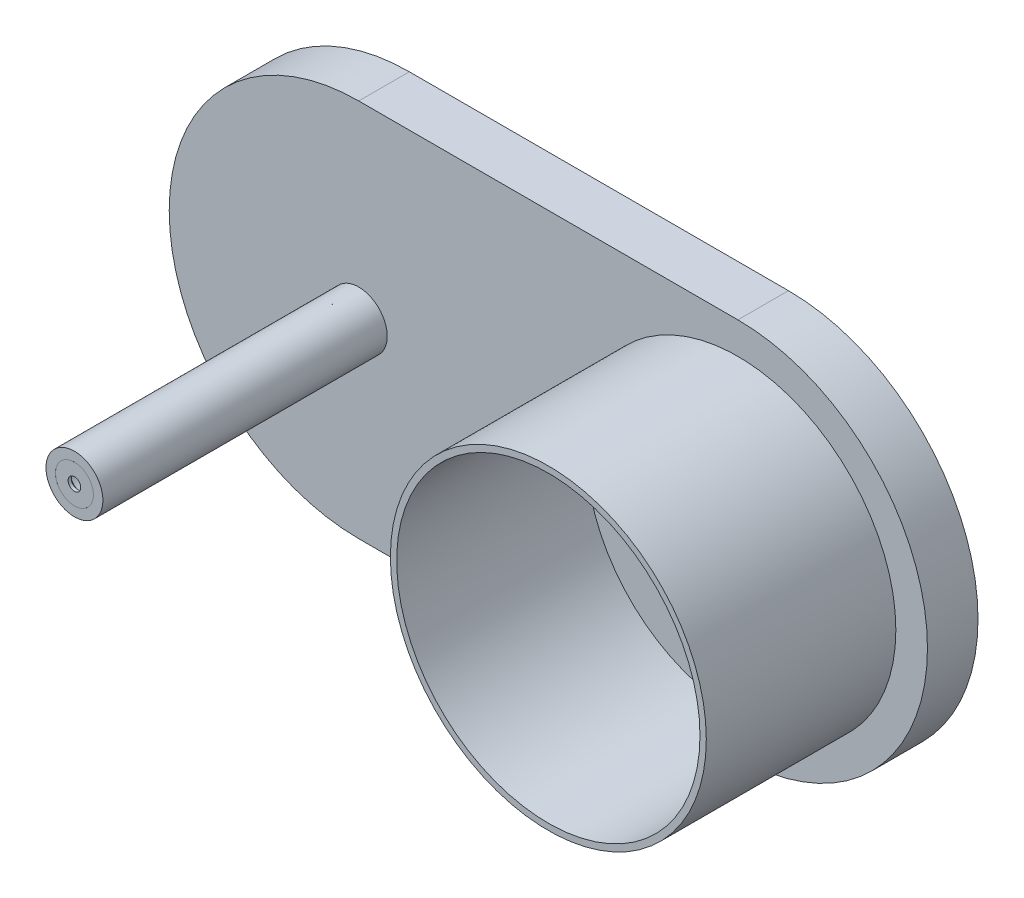
ISO-10303-21;
HEADER;
FILE_DESCRIPTION(('STEP AP214'),'2;1');
FILE_NAME('part.step','',(''),(''),'','','');
FILE_SCHEMA(('AUTOMOTIVE_DESIGN { 1 0 10303 214 1 1 1 1 }'));
ENDSEC;
DATA;
#1=APPLICATION_CONTEXT('core data for automotive mechanical design processes');
#2=APPLICATION_PROTOCOL_DEFINITION('international standard','automotive_design',2000,#1);
#3=PRODUCT_CONTEXT('',#1,'mechanical');
#4=PRODUCT('Part','Part','',(#3));
#5=PRODUCT_RELATED_PRODUCT_CATEGORY('part','',(#4));
#6=PRODUCT_DEFINITION_FORMATION('','',#4);
#7=PRODUCT_DEFINITION_CONTEXT('part definition',#1,'design');
#8=PRODUCT_DEFINITION('design','',#6,#7);
#9=PRODUCT_DEFINITION_SHAPE('','',#8);
#10=(LENGTH_UNIT() NAMED_UNIT(*) SI_UNIT(.MILLI.,.METRE.));
#11=(NAMED_UNIT(*) PLANE_ANGLE_UNIT() SI_UNIT($,.RADIAN.));
#12=(NAMED_UNIT(*) SI_UNIT($,.STERADIAN.) SOLID_ANGLE_UNIT());
#13=UNCERTAINTY_MEASURE_WITH_UNIT(LENGTH_MEASURE(1.E-05),#10,'distance_accuracy_value','');
#14=(GEOMETRIC_REPRESENTATION_CONTEXT(3) GLOBAL_UNCERTAINTY_ASSIGNED_CONTEXT((#13)) GLOBAL_UNIT_ASSIGNED_CONTEXT((#10,
#11,#12)) REPRESENTATION_CONTEXT('',''));
#15=CARTESIAN_POINT('',(0.,0.,0.));
#16=DIRECTION('',(0.,0.,1.));
#17=DIRECTION('',(1.,0.,0.));
#18=AXIS2_PLACEMENT_3D('',#15,#16,#17);
#19=CARTESIAN_POINT('',(-30.,0.,8.));
#20=DIRECTION('',(0.,0.,1.));
#21=DIRECTION('',(1.,0.,0.));
#22=AXIS2_PLACEMENT_3D('',#19,#20,#21);
#23=PLANE('',#22);
#24=CARTESIAN_POINT('',(30.,0.,8.));
#25=DIRECTION('',(0.,0.,1.));
#26=DIRECTION('',(1.,0.,0.));
#27=AXIS2_PLACEMENT_3D('',#24,#25,#26);
#28=CIRCLE('',#27,4.);
#29=CARTESIAN_POINT('',(34.,0.,8.));
#30=VERTEX_POINT('',#29);
#31=EDGE_CURVE('E149',#30,#30,#28,.T.);
#32=ORIENTED_EDGE('',*,*,#31,.F.);
#33=EDGE_LOOP('',(#32));
#34=FACE_BOUND('',#33,.T.);
#35=CARTESIAN_POINT('',(30.,0.,8.));
#36=DIRECTION('',(0.,0.,1.));
#37=DIRECTION('',(1.,0.,0.));
#38=AXIS2_PLACEMENT_3D('',#35,#36,#37);
#39=CIRCLE('',#38,24.);
#40=CARTESIAN_POINT('',(54.,0.,8.));
#41=VERTEX_POINT('',#40);
#42=EDGE_CURVE('E11',#41,#41,#39,.F.);
#43=ORIENTED_EDGE('',*,*,#42,.F.);
#44=EDGE_LOOP('',(#43));
#45=FACE_BOUND('',#44,.T.);
#46=ADVANCED_FACE('F39',(#34,#45),#23,.T.);
#47=CARTESIAN_POINT('',(-30.,0.,2.5));
#48=DIRECTION('',(0.,0.,1.));
#49=DIRECTION('',(1.,0.,0.));
#50=AXIS2_PLACEMENT_3D('',#47,#48,#49);
#51=CYLINDRICAL_SURFACE('',#50,3.);
#52=CARTESIAN_POINT('',(-30.,0.,52.9993084249423));
#53=DIRECTION('',(0.,0.,-1.));
#54=DIRECTION('',(-1.,0.,0.));
#55=AXIS2_PLACEMENT_3D('',#52,#53,#54);
#56=CIRCLE('',#55,2.99999999999998);
#57=CARTESIAN_POINT('',(-33.,0.,52.9993084249423));
#58=VERTEX_POINT('',#57);
#59=EDGE_CURVE('E270',#58,#58,#56,.T.);
#60=ORIENTED_EDGE('',*,*,#59,.T.);
#61=EDGE_LOOP('',(#60));
#62=FACE_BOUND('',#61,.T.);
#63=CARTESIAN_POINT('',(-30.,0.,53.));
#64=DIRECTION('',(0.,0.,1.));
#65=DIRECTION('',(1.,0.,0.));
#66=AXIS2_PLACEMENT_3D('',#63,#64,#65);
#67=CIRCLE('',#66,3.);
#68=CARTESIAN_POINT('',(-27.,0.,53.));
#69=VERTEX_POINT('',#68);
#70=EDGE_CURVE('E251',#69,#69,#67,.T.);
#71=ORIENTED_EDGE('',*,*,#70,.T.);
#72=EDGE_LOOP('',(#71));
#73=FACE_BOUND('',#72,.T.);
#74=ADVANCED_FACE('F307',(#62,#73),#51,.F.);
#75=CARTESIAN_POINT('',(30.,0.,8.));
#76=DIRECTION('',(0.,0.,1.));
#77=DIRECTION('',(1.,0.,0.));
#78=AXIS2_PLACEMENT_3D('',#75,#76,#77);
#79=CIRCLE('',#78,25.);
#80=CARTESIAN_POINT('',(55.,0.,8.));
#81=VERTEX_POINT('',#80);
#82=EDGE_CURVE('E275',#81,#81,#79,.T.);
#83=ORIENTED_EDGE('',*,*,#82,.F.);
#84=EDGE_LOOP('',(#83));
#85=FACE_BOUND('',#84,.T.);
#86=CARTESIAN_POINT('',(-30.,0.,8.));
#87=DIRECTION('',(0.,0.,1.));
#88=DIRECTION('',(1.,0.,0.));
#89=AXIS2_PLACEMENT_3D('',#86,#87,#88);
#90=CIRCLE('',#89,30.);
#91=CARTESIAN_POINT('',(-30.,30.,8.));
#92=VERTEX_POINT('',#91);
#93=CARTESIAN_POINT('',(-30.,-30.,8.));
#94=VERTEX_POINT('',#93);
#95=EDGE_CURVE('E175',#92,#94,#90,.T.);
#96=ORIENTED_EDGE('',*,*,#95,.T.);
#97=DIRECTION('',(1.,0.,0.));
#98=VECTOR('',#97,1.);
#99=CARTESIAN_POINT('',(-30.,-30.,8.));
#100=LINE('',#99,#98);
#101=CARTESIAN_POINT('',(30.,-30.,8.));
#102=VERTEX_POINT('',#101);
#103=EDGE_CURVE('E93',#94,#102,#100,.T.);
#104=ORIENTED_EDGE('',*,*,#103,.T.);
#105=CARTESIAN_POINT('',(30.,0.,8.));
#106=DIRECTION('',(0.,0.,1.));
#107=DIRECTION('',(1.,0.,0.));
#108=AXIS2_PLACEMENT_3D('',#105,#106,#107);
#109=CIRCLE('',#108,30.);
#110=CARTESIAN_POINT('',(30.,30.,8.));
#111=VERTEX_POINT('',#110);
#112=EDGE_CURVE('E180',#102,#111,#109,.T.);
#113=ORIENTED_EDGE('',*,*,#112,.T.);
#114=DIRECTION('',(-1.,0.,0.));
#115=VECTOR('',#114,1.);
#116=CARTESIAN_POINT('',(-30.,30.,8.));
#117=LINE('',#116,#115);
#118=EDGE_CURVE('E64',#111,#92,#117,.T.);
#119=ORIENTED_EDGE('',*,*,#118,.T.);
#120=EDGE_LOOP('',(#96,#104,#113,#119));
#121=FACE_BOUND('',#120,.T.);
#122=CARTESIAN_POINT('',(-30.,0.,8.));
#123=DIRECTION('',(0.,0.,1.));
#124=DIRECTION('',(1.,0.,0.));
#125=AXIS2_PLACEMENT_3D('',#122,#123,#124);
#126=CIRCLE('',#125,4.5);
#127=CARTESIAN_POINT('',(-34.5,0.,7.99999999999999));
#128=VERTEX_POINT('',#127);
#129=EDGE_CURVE('E247',#128,#128,#126,.T.);
#130=ORIENTED_EDGE('',*,*,#129,.F.);
#131=EDGE_LOOP('',(#130));
#132=FACE_BOUND('',#131,.T.);
#133=ADVANCED_FACE('F310',(#85,#121,#132),#23,.T.);
#134=CARTESIAN_POINT('',(-30.,-4.,5.5));
#135=DIRECTION('',(-1.,0.,0.));
#136=DIRECTION('',(0.,0.,1.));
#137=AXIS2_PLACEMENT_3D('',#134,#135,#136);
#138=PLANE('',#137);
#139=DIRECTION('',(0.,1.,0.));
#140=VECTOR('',#139,1.);
#141=CARTESIAN_POINT('',(-30.,-4.,2.5));
#142=LINE('',#141,#140);
#143=CARTESIAN_POINT('',(-30.,-4.,2.5));
#144=VERTEX_POINT('',#143);
#145=CARTESIAN_POINT('',(-30.,-3.,2.5));
#146=VERTEX_POINT('',#145);
#147=EDGE_CURVE('E164',#144,#146,#142,.T.);
#148=ORIENTED_EDGE('',*,*,#147,.T.);
#149=DIRECTION('',(0.,0.,1.));
#150=VECTOR('',#149,1.);
#151=CARTESIAN_POINT('',(-30.,-3.,2.5));
#152=LINE('',#151,#150);
#153=CARTESIAN_POINT('',(-30.,-3.,5.5));
#154=VERTEX_POINT('',#153);
#155=EDGE_CURVE('E226',#146,#154,#152,.T.);
#156=ORIENTED_EDGE('',*,*,#155,.T.);
#157=DIRECTION('',(0.,1.,0.));
#158=VECTOR('',#157,1.);
#159=CARTESIAN_POINT('',(-30.,-4.,5.5));
#160=LINE('',#159,#158);
#161=CARTESIAN_POINT('',(-30.,-4.,5.5));
#162=VERTEX_POINT('',#161);
#163=EDGE_CURVE('E170',#162,#154,#160,.T.);
#164=ORIENTED_EDGE('',*,*,#163,.F.);
#165=DIRECTION('',(0.,0.,1.));
#166=VECTOR('',#165,1.);
#167=CARTESIAN_POINT('',(-30.,-4.,5.5));
#168=LINE('',#167,#166);
#169=EDGE_CURVE('E156',#144,#162,#168,.T.);
#170=ORIENTED_EDGE('',*,*,#169,.F.);
#171=EDGE_LOOP('',(#148,#156,#164,#170));
#172=FACE_BOUND('',#171,.T.);
#173=ADVANCED_FACE('F322',(#172),#138,.F.);
#174=CARTESIAN_POINT('',(-30.,3.,5.5));
#175=VERTEX_POINT('',#174);
#176=CARTESIAN_POINT('',(-30.,4.,5.5));
#177=VERTEX_POINT('',#176);
#178=EDGE_CURVE('E174',#175,#177,#160,.T.);
#179=ORIENTED_EDGE('',*,*,#178,.F.);
#180=DIRECTION('',(0.,0.,1.));
#181=VECTOR('',#180,1.);
#182=CARTESIAN_POINT('',(-30.,3.,2.5));
#183=LINE('',#182,#181);
#184=CARTESIAN_POINT('',(-30.,3.,2.5));
#185=VERTEX_POINT('',#184);
#186=EDGE_CURVE('E55',#175,#185,#183,.F.);
#187=ORIENTED_EDGE('',*,*,#186,.T.);
#188=CARTESIAN_POINT('',(-30.,4.,2.5));
#189=VERTEX_POINT('',#188);
#190=EDGE_CURVE('E169',#185,#189,#142,.T.);
#191=ORIENTED_EDGE('',*,*,#190,.T.);
#192=DIRECTION('',(0.,0.,1.));
#193=VECTOR('',#192,1.);
#194=CARTESIAN_POINT('',(-30.,4.,5.5));
#195=LINE('',#194,#193);
#196=EDGE_CURVE('E154',#189,#177,#195,.T.);
#197=ORIENTED_EDGE('',*,*,#196,.T.);
#198=EDGE_LOOP('',(#179,#187,#191,#197));
#199=FACE_BOUND('',#198,.T.);
#200=ADVANCED_FACE('F215',(#199),#138,.F.);
#201=CARTESIAN_POINT('',(-30.,-4.,2.5));
#202=DIRECTION('',(0.,0.,-1.));
#203=DIRECTION('',(-1.,0.,0.));
#204=AXIS2_PLACEMENT_3D('',#201,#202,#203);
#205=PLANE('',#204);
#206=DIRECTION('',(-1.,0.,0.));
#207=VECTOR('',#206,1.);
#208=CARTESIAN_POINT('',(-30.,-4.,2.5));
#209=LINE('',#208,#207);
#210=CARTESIAN_POINT('',(30.,-4.,2.5));
#211=VERTEX_POINT('',#210);
#212=EDGE_CURVE('E147',#211,#144,#209,.T.);
#213=ORIENTED_EDGE('',*,*,#212,.F.);
#214=CARTESIAN_POINT('',(30.,0.,2.5));
#215=DIRECTION('',(0.,0.,1.));
#216=DIRECTION('',(1.,0.,0.));
#217=AXIS2_PLACEMENT_3D('',#214,#215,#216);
#218=CIRCLE('',#217,4.);
#219=CARTESIAN_POINT('',(30.,4.,2.5));
#220=VERTEX_POINT('',#219);
#221=EDGE_CURVE('E129',#211,#220,#218,.T.);
#222=ORIENTED_EDGE('',*,*,#221,.T.);
#223=DIRECTION('',(-1.,0.,0.));
#224=VECTOR('',#223,1.);
#225=CARTESIAN_POINT('',(-30.,4.,2.5));
#226=LINE('',#225,#224);
#227=EDGE_CURVE('E138',#220,#189,#226,.T.);
#228=ORIENTED_EDGE('',*,*,#227,.T.);
#229=ORIENTED_EDGE('',*,*,#190,.F.);
#230=CARTESIAN_POINT('',(-30.,0.,2.5));
#231=DIRECTION('',(0.,0.,1.));
#232=DIRECTION('',(1.,0.,0.));
#233=AXIS2_PLACEMENT_3D('',#230,#231,#232);
#234=CIRCLE('',#233,3.);
#235=EDGE_CURVE('E239',#185,#146,#234,.T.);
#236=ORIENTED_EDGE('',*,*,#235,.T.);
#237=ORIENTED_EDGE('',*,*,#147,.F.);
#238=EDGE_LOOP('',(#213,#222,#228,#229,#236,#237));
#239=FACE_BOUND('',#238,.T.);
#240=ADVANCED_FACE('F144',(#239),#205,.F.);
#241=CARTESIAN_POINT('',(-30.,-4.,5.5));
#242=DIRECTION('',(0.,0.,1.));
#243=DIRECTION('',(1.,0.,0.));
#244=AXIS2_PLACEMENT_3D('',#241,#242,#243);
#245=PLANE('',#244);
#246=DIRECTION('',(1.,0.,0.));
#247=VECTOR('',#246,1.);
#248=CARTESIAN_POINT('',(-30.,4.,5.5));
#249=LINE('',#248,#247);
#250=CARTESIAN_POINT('',(30.,4.,5.5));
#251=VERTEX_POINT('',#250);
#252=EDGE_CURVE('E139',#177,#251,#249,.T.);
#253=ORIENTED_EDGE('',*,*,#252,.T.);
#254=CARTESIAN_POINT('',(30.,0.,5.5));
#255=DIRECTION('',(0.,0.,1.));
#256=DIRECTION('',(1.,0.,0.));
#257=AXIS2_PLACEMENT_3D('',#254,#255,#256);
#258=CIRCLE('',#257,4.);
#259=CARTESIAN_POINT('',(30.,-4.,5.5));
#260=VERTEX_POINT('',#259);
#261=EDGE_CURVE('E132',#251,#260,#258,.T.);
#262=ORIENTED_EDGE('',*,*,#261,.T.);
#263=DIRECTION('',(1.,0.,0.));
#264=VECTOR('',#263,1.);
#265=CARTESIAN_POINT('',(-30.,-4.,5.5));
#266=LINE('',#265,#264);
#267=EDGE_CURVE('E160',#162,#260,#266,.T.);
#268=ORIENTED_EDGE('',*,*,#267,.F.);
#269=ORIENTED_EDGE('',*,*,#163,.T.);
#270=CARTESIAN_POINT('',(-30.,0.,5.5));
#271=DIRECTION('',(0.,0.,1.));
#272=DIRECTION('',(1.,0.,0.));
#273=AXIS2_PLACEMENT_3D('',#270,#271,#272);
#274=CIRCLE('',#273,3.);
#275=EDGE_CURVE('E48',#154,#175,#274,.T.);
#276=ORIENTED_EDGE('',*,*,#275,.T.);
#277=ORIENTED_EDGE('',*,*,#178,.T.);
#278=EDGE_LOOP('',(#253,#262,#268,#269,#276,#277));
#279=FACE_BOUND('',#278,.T.);
#280=ADVANCED_FACE('F211',(#279),#245,.F.);
#281=CARTESIAN_POINT('',(0.,-4.,0.));
#282=DIRECTION('',(0.,-1.,0.));
#283=DIRECTION('',(0.,0.,-1.));
#284=AXIS2_PLACEMENT_3D('',#281,#282,#283);
#285=PLANE('',#284);
#286=ORIENTED_EDGE('',*,*,#169,.T.);
#287=ORIENTED_EDGE('',*,*,#267,.T.);
#288=DIRECTION('',(0.,0.,-1.));
#289=VECTOR('',#288,1.);
#290=CARTESIAN_POINT('',(30.,-4.,5.5));
#291=LINE('',#290,#289);
#292=EDGE_CURVE('E218',#260,#211,#291,.T.);
#293=ORIENTED_EDGE('',*,*,#292,.T.);
#294=ORIENTED_EDGE('',*,*,#212,.T.);
#295=EDGE_LOOP('',(#286,#287,#293,#294));
#296=FACE_BOUND('',#295,.T.);
#297=ADVANCED_FACE('F231',(#296),#285,.F.);
#298=CARTESIAN_POINT('',(0.,4.,0.));
#299=DIRECTION('',(0.,-1.,0.));
#300=DIRECTION('',(0.,0.,-1.));
#301=AXIS2_PLACEMENT_3D('',#298,#299,#300);
#302=PLANE('',#301);
#303=ORIENTED_EDGE('',*,*,#196,.F.);
#304=ORIENTED_EDGE('',*,*,#227,.F.);
#305=DIRECTION('',(0.,0.,-1.));
#306=VECTOR('',#305,1.);
#307=CARTESIAN_POINT('',(30.,4.,5.5));
#308=LINE('',#307,#306);
#309=EDGE_CURVE('E126',#251,#220,#308,.T.);
#310=ORIENTED_EDGE('',*,*,#309,.F.);
#311=ORIENTED_EDGE('',*,*,#252,.F.);
#312=EDGE_LOOP('',(#303,#304,#310,#311));
#313=FACE_BOUND('',#312,.T.);
#314=ADVANCED_FACE('F152',(#313),#302,.T.);
#315=CARTESIAN_POINT('',(30.,0.,2.5));
#316=DIRECTION('',(0.,0.,1.));
#317=DIRECTION('',(1.,0.,0.));
#318=AXIS2_PLACEMENT_3D('',#315,#316,#317);
#319=CYLINDRICAL_SURFACE('',#318,4.);
#320=ORIENTED_EDGE('',*,*,#31,.T.);
#321=EDGE_LOOP('',(#320));
#322=FACE_BOUND('',#321,.T.);
#323=ORIENTED_EDGE('',*,*,#261,.F.);
#324=ORIENTED_EDGE('',*,*,#309,.T.);
#325=ORIENTED_EDGE('',*,*,#221,.F.);
#326=ORIENTED_EDGE('',*,*,#292,.F.);
#327=EDGE_LOOP('',(#323,#324,#325,#326));
#328=FACE_BOUND('',#327,.T.);
#329=ADVANCED_FACE('F128',(#322,#328),#319,.F.);
#330=CARTESIAN_POINT('',(-30.,0.,50.9993084249423));
#331=DIRECTION('',(0.,0.,-1.));
#332=DIRECTION('',(-1.,0.,0.));
#333=AXIS2_PLACEMENT_3D('',#330,#331,#332);
#334=CIRCLE('',#333,2.99999999999998);
#335=CARTESIAN_POINT('',(-33.,0.,50.9993084249423));
#336=VERTEX_POINT('',#335);
#337=EDGE_CURVE('E266',#336,#336,#334,.T.);
#338=ORIENTED_EDGE('',*,*,#337,.F.);
#339=EDGE_LOOP('',(#338));
#340=FACE_BOUND('',#339,.T.);
#341=ORIENTED_EDGE('',*,*,#235,.F.);
#342=ORIENTED_EDGE('',*,*,#186,.F.);
#343=ORIENTED_EDGE('',*,*,#275,.F.);
#344=ORIENTED_EDGE('',*,*,#155,.F.);
#345=EDGE_LOOP('',(#341,#342,#343,#344));
#346=FACE_BOUND('',#345,.T.);
#347=ADVANCED_FACE('F316',(#340,#346),#51,.F.);
#348=CARTESIAN_POINT('',(-30.,0.,8.));
#349=DIRECTION('',(0.,0.,-1.));
#350=DIRECTION('',(-1.,0.,0.));
#351=AXIS2_PLACEMENT_3D('',#348,#349,#350);
#352=CYLINDRICAL_SURFACE('',#351,30.);
#353=CARTESIAN_POINT('',(-30.,0.,0.));
#354=DIRECTION('',(0.,0.,1.));
#355=DIRECTION('',(1.,0.,0.));
#356=AXIS2_PLACEMENT_3D('',#353,#354,#355);
#357=CIRCLE('',#356,30.);
#358=CARTESIAN_POINT('',(-30.,30.,0.));
#359=VERTEX_POINT('',#358);
#360=CARTESIAN_POINT('',(-30.,-30.,0.));
#361=VERTEX_POINT('',#360);
#362=EDGE_CURVE('E168',#359,#361,#357,.T.);
#363=ORIENTED_EDGE('',*,*,#362,.T.);
#364=DIRECTION('',(0.,0.,-1.));
#365=VECTOR('',#364,1.);
#366=CARTESIAN_POINT('',(-30.,-30.,8.));
#367=LINE('',#366,#365);
#368=EDGE_CURVE('E206',#94,#361,#367,.T.);
#369=ORIENTED_EDGE('',*,*,#368,.F.);
#370=ORIENTED_EDGE('',*,*,#95,.F.);
#371=DIRECTION('',(0.,0.,-1.));
#372=VECTOR('',#371,1.);
#373=CARTESIAN_POINT('',(-30.,30.,8.));
#374=LINE('',#373,#372);
#375=EDGE_CURVE('E185',#92,#359,#374,.T.);
#376=ORIENTED_EDGE('',*,*,#375,.T.);
#377=EDGE_LOOP('',(#363,#369,#370,#376));
#378=FACE_BOUND('',#377,.T.);
#379=ADVANCED_FACE('F41',(#378),#352,.T.);
#380=CARTESIAN_POINT('',(-30.,-30.,8.));
#381=DIRECTION('',(0.,1.,0.));
#382=DIRECTION('',(-1.,0.,0.));
#383=AXIS2_PLACEMENT_3D('',#380,#381,#382);
#384=PLANE('',#383);
#385=DIRECTION('',(1.,0.,0.));
#386=VECTOR('',#385,1.);
#387=CARTESIAN_POINT('',(-30.,-30.,0.));
#388=LINE('',#387,#386);
#389=CARTESIAN_POINT('',(30.,-30.,0.));
#390=VERTEX_POINT('',#389);
#391=EDGE_CURVE('E189',#361,#390,#388,.T.);
#392=ORIENTED_EDGE('',*,*,#391,.T.);
#393=DIRECTION('',(0.,0.,-1.));
#394=VECTOR('',#393,1.);
#395=CARTESIAN_POINT('',(30.,-30.,8.));
#396=LINE('',#395,#394);
#397=EDGE_CURVE('E202',#102,#390,#396,.T.);
#398=ORIENTED_EDGE('',*,*,#397,.F.);
#399=ORIENTED_EDGE('',*,*,#103,.F.);
#400=ORIENTED_EDGE('',*,*,#368,.T.);
#401=EDGE_LOOP('',(#392,#398,#399,#400));
#402=FACE_BOUND('',#401,.T.);
#403=ADVANCED_FACE('F401',(#402),#384,.F.);
#404=CARTESIAN_POINT('',(30.,0.,8.));
#405=DIRECTION('',(0.,0.,-1.));
#406=DIRECTION('',(-1.,0.,0.));
#407=AXIS2_PLACEMENT_3D('',#404,#405,#406);
#408=CYLINDRICAL_SURFACE('',#407,30.);
#409=CARTESIAN_POINT('',(30.,0.,0.));
#410=DIRECTION('',(0.,0.,1.));
#411=DIRECTION('',(1.,0.,0.));
#412=AXIS2_PLACEMENT_3D('',#409,#410,#411);
#413=CIRCLE('',#412,30.);
#414=CARTESIAN_POINT('',(30.,30.,0.));
#415=VERTEX_POINT('',#414);
#416=EDGE_CURVE('E192',#390,#415,#413,.T.);
#417=ORIENTED_EDGE('',*,*,#416,.T.);
#418=DIRECTION('',(0.,0.,-1.));
#419=VECTOR('',#418,1.);
#420=CARTESIAN_POINT('',(30.,30.,8.));
#421=LINE('',#420,#419);
#422=EDGE_CURVE('E199',#111,#415,#421,.T.);
#423=ORIENTED_EDGE('',*,*,#422,.F.);
#424=ORIENTED_EDGE('',*,*,#112,.F.);
#425=ORIENTED_EDGE('',*,*,#397,.T.);
#426=EDGE_LOOP('',(#417,#423,#424,#425));
#427=FACE_BOUND('',#426,.T.);
#428=ADVANCED_FACE('F408',(#427),#408,.T.);
#429=CARTESIAN_POINT('',(-30.,30.,8.));
#430=DIRECTION('',(0.,-1.,0.));
#431=DIRECTION('',(1.,0.,0.));
#432=AXIS2_PLACEMENT_3D('',#429,#430,#431);
#433=PLANE('',#432);
#434=DIRECTION('',(-1.,0.,0.));
#435=VECTOR('',#434,1.);
#436=CARTESIAN_POINT('',(-30.,30.,0.));
#437=LINE('',#436,#435);
#438=EDGE_CURVE('E85',#415,#359,#437,.T.);
#439=ORIENTED_EDGE('',*,*,#438,.T.);
#440=ORIENTED_EDGE('',*,*,#375,.F.);
#441=ORIENTED_EDGE('',*,*,#118,.F.);
#442=ORIENTED_EDGE('',*,*,#422,.T.);
#443=EDGE_LOOP('',(#439,#440,#441,#442));
#444=FACE_BOUND('',#443,.T.);
#445=ADVANCED_FACE('F414',(#444),#433,.F.);
#446=CARTESIAN_POINT('',(-30.,0.,0.));
#447=DIRECTION('',(0.,0.,1.));
#448=DIRECTION('',(1.,0.,0.));
#449=AXIS2_PLACEMENT_3D('',#446,#447,#448);
#450=PLANE('',#449);
#451=ORIENTED_EDGE('',*,*,#362,.F.);
#452=ORIENTED_EDGE('',*,*,#438,.F.);
#453=ORIENTED_EDGE('',*,*,#416,.F.);
#454=ORIENTED_EDGE('',*,*,#391,.F.);
#455=EDGE_LOOP('',(#451,#452,#453,#454));
#456=FACE_BOUND('',#455,.T.);
#457=ADVANCED_FACE('F346',(#456),#450,.F.);
#458=CARTESIAN_POINT('',(-30.,0.,53.));
#459=DIRECTION('',(0.,0.,1.));
#460=DIRECTION('',(1.,0.,0.));
#461=AXIS2_PLACEMENT_3D('',#458,#459,#460);
#462=PLANE('',#461);
#463=CARTESIAN_POINT('',(-30.,0.,53.));
#464=DIRECTION('',(0.,0.,1.));
#465=DIRECTION('',(1.,0.,0.));
#466=AXIS2_PLACEMENT_3D('',#463,#464,#465);
#467=CIRCLE('',#466,4.5);
#468=CARTESIAN_POINT('',(-34.5,0.,53.));
#469=VERTEX_POINT('',#468);
#470=EDGE_CURVE('E243',#469,#469,#467,.T.);
#471=ORIENTED_EDGE('',*,*,#470,.T.);
#472=EDGE_LOOP('',(#471));
#473=FACE_BOUND('',#472,.T.);
#474=ORIENTED_EDGE('',*,*,#70,.F.);
#475=EDGE_LOOP('',(#474));
#476=FACE_BOUND('',#475,.T.);
#477=ADVANCED_FACE('F337',(#473,#476),#462,.T.);
#478=CARTESIAN_POINT('',(-30.,0.,53.));
#479=DIRECTION('',(0.,0.,-1.));
#480=DIRECTION('',(-1.,0.,0.));
#481=AXIS2_PLACEMENT_3D('',#478,#479,#480);
#482=CYLINDRICAL_SURFACE('',#481,4.5);
#483=CARTESIAN_POINT('',(-34.5,0.,53.));
#484=CARTESIAN_POINT('',(-34.5,0.,52.53125));
#485=CARTESIAN_POINT('',(-34.5,0.,52.0625));
#486=CARTESIAN_POINT('',(-34.5,0.,51.125));
#487=CARTESIAN_POINT('',(-34.5,0.,50.65625));
#488=CARTESIAN_POINT('',(-34.5,0.,49.71875));
#489=CARTESIAN_POINT('',(-34.5,0.,49.25));
#490=CARTESIAN_POINT('',(-34.5,0.,48.3125));
#491=CARTESIAN_POINT('',(-34.5,0.,47.84375));
#492=CARTESIAN_POINT('',(-34.5,0.,46.90625));
#493=CARTESIAN_POINT('',(-34.5,0.,46.4375));
#494=CARTESIAN_POINT('',(-34.5,0.,45.5));
#495=CARTESIAN_POINT('',(-34.5,0.,45.03125));
#496=CARTESIAN_POINT('',(-34.5,0.,44.09375));
#497=CARTESIAN_POINT('',(-34.5,0.,43.625));
#498=CARTESIAN_POINT('',(-34.5,0.,42.6875));
#499=CARTESIAN_POINT('',(-34.5,0.,42.21875));
#500=CARTESIAN_POINT('',(-34.5,0.,41.28125));
#501=CARTESIAN_POINT('',(-34.5,0.,40.8125));
#502=CARTESIAN_POINT('',(-34.5,0.,39.875));
#503=CARTESIAN_POINT('',(-34.5,0.,39.40625));
#504=CARTESIAN_POINT('',(-34.5,0.,38.46875));
#505=CARTESIAN_POINT('',(-34.5,0.,38.));
#506=CARTESIAN_POINT('',(-34.5,0.,37.0625));
#507=CARTESIAN_POINT('',(-34.5,0.,36.59375));
#508=CARTESIAN_POINT('',(-34.5,0.,35.65625));
#509=CARTESIAN_POINT('',(-34.5,0.,35.1875));
#510=CARTESIAN_POINT('',(-34.5,0.,34.25));
#511=CARTESIAN_POINT('',(-34.5,0.,33.78125));
#512=CARTESIAN_POINT('',(-34.5,0.,32.84375));
#513=CARTESIAN_POINT('',(-34.5,0.,32.375));
#514=CARTESIAN_POINT('',(-34.5,0.,31.4375));
#515=CARTESIAN_POINT('',(-34.5,0.,30.96875));
#516=CARTESIAN_POINT('',(-34.5,0.,30.03125));
#517=CARTESIAN_POINT('',(-34.5,0.,29.5625));
#518=CARTESIAN_POINT('',(-34.5,0.,28.625));
#519=CARTESIAN_POINT('',(-34.5,0.,28.15625));
#520=CARTESIAN_POINT('',(-34.5,0.,27.21875));
#521=CARTESIAN_POINT('',(-34.5,0.,26.75));
#522=CARTESIAN_POINT('',(-34.5,0.,25.8125));
#523=CARTESIAN_POINT('',(-34.5,0.,25.34375));
#524=CARTESIAN_POINT('',(-34.5,0.,24.40625));
#525=CARTESIAN_POINT('',(-34.5,0.,23.9375));
#526=CARTESIAN_POINT('',(-34.5,0.,23.));
#527=CARTESIAN_POINT('',(-34.5,0.,22.53125));
#528=CARTESIAN_POINT('',(-34.5,0.,21.59375));
#529=CARTESIAN_POINT('',(-34.5,0.,21.125));
#530=CARTESIAN_POINT('',(-34.5,0.,20.1875));
#531=CARTESIAN_POINT('',(-34.5,0.,19.71875));
#532=CARTESIAN_POINT('',(-34.5,0.,18.78125));
#533=CARTESIAN_POINT('',(-34.5,0.,18.3125));
#534=CARTESIAN_POINT('',(-34.5,0.,17.375));
#535=CARTESIAN_POINT('',(-34.5,0.,16.90625));
#536=CARTESIAN_POINT('',(-34.5,0.,15.96875));
#537=CARTESIAN_POINT('',(-34.5,0.,15.5));
#538=CARTESIAN_POINT('',(-34.5,0.,14.5625));
#539=CARTESIAN_POINT('',(-34.5,0.,14.09375));
#540=CARTESIAN_POINT('',(-34.5,0.,13.15625));
#541=CARTESIAN_POINT('',(-34.5,0.,12.6875));
#542=CARTESIAN_POINT('',(-34.5,0.,11.75));
#543=CARTESIAN_POINT('',(-34.5,0.,11.28125));
#544=CARTESIAN_POINT('',(-34.5,0.,10.34375));
#545=CARTESIAN_POINT('',(-34.5,0.,9.87499999999999));
#546=CARTESIAN_POINT('',(-34.5,0.,8.93749999999999));
#547=CARTESIAN_POINT('',(-34.5,0.,8.46874999999999));
#548=CARTESIAN_POINT('',(-34.5,0.,7.99999999999999));
#549=B_SPLINE_CURVE_WITH_KNOTS('',3,(#483,#484,#485,#486,#487,#488,#489,#490,#491,#492,#493,
#494,#495,#496,#497,#498,#499,#500,#501,#502,#503,#504,#505,#506,#507,#508,#509,#510,#511,#512,
#513,#514,#515,#516,#517,#518,#519,#520,#521,#522,#523,#524,#525,#526,#527,#528,#529,#530,#531,
#532,#533,#534,#535,#536,#537,#538,#539,#540,#541,#542,#543,#544,#545,#546,#547,#548),
.UNSPECIFIED.,.F.,.F.,(4,2,2,2,2,2,2,2,2,2,2,2,2,2,2,2,2,2,2,2,2,2,2,2,2,2,2,2,2,2,2,2,4),(0.,
1.40625,2.8125,4.21874999999999,5.625,7.03125,8.43749999999999,9.84375,11.25,12.65625,14.0625,
15.46875,16.875,18.28125,19.6875,21.09375,22.5,23.90625,25.3125,26.71875,28.125,29.53125,
30.9375,32.34375,33.75,35.15625,36.5625,37.96875,39.375,40.78125,42.1875,43.59375,45.),.UNSPECIFIED.);
#550=EDGE_CURVE('BSEAM334',#469,#128,#549,.T.);
#551=ORIENTED_EDGE('',*,*,#470,.F.);
#552=ORIENTED_EDGE('',*,*,#129,.T.);
#553=ORIENTED_EDGE('',*,*,#550,.T.);
#554=ORIENTED_EDGE('',*,*,#550,.F.);
#555=EDGE_LOOP('',(#551,#553,#552,#554));
#556=FACE_BOUND('',#555,.T.);
#557=ADVANCED_FACE('F334',(#556),#482,.T.);
#558=CARTESIAN_POINT('',(-33.,0.,52.9993084249423));
#559=DIRECTION('',(0.,0.,1.));
#560=DIRECTION('',(1.,0.,0.));
#561=AXIS2_PLACEMENT_3D('',#558,#559,#560);
#562=PLANE('',#561);
#563=CARTESIAN_POINT('',(-30.,0.,52.9993084249423));
#564=DIRECTION('',(0.,0.,-1.));
#565=DIRECTION('',(-1.,0.,0.));
#566=AXIS2_PLACEMENT_3D('',#563,#564,#565);
#567=CIRCLE('',#566,0.99999999999998);
#568=CARTESIAN_POINT('',(-31.,0.,52.9993084249423));
#569=VERTEX_POINT('',#568);
#570=EDGE_CURVE('E258',#569,#569,#567,.T.);
#571=ORIENTED_EDGE('',*,*,#570,.T.);
#572=EDGE_LOOP('',(#571));
#573=FACE_BOUND('',#572,.T.);
#574=ORIENTED_EDGE('',*,*,#59,.F.);
#575=EDGE_LOOP('',(#574));
#576=FACE_BOUND('',#575,.T.);
#577=ADVANCED_FACE('F336',(#573,#576),#562,.T.);
#578=CARTESIAN_POINT('',(-30.,0.,53.));
#579=DIRECTION('',(0.,0.,-1.));
#580=DIRECTION('',(-1.,0.,0.));
#581=AXIS2_PLACEMENT_3D('',#578,#579,#580);
#582=CYLINDRICAL_SURFACE('',#581,0.99999999999998);
#583=CARTESIAN_POINT('',(-30.,0.,52.4993084249423));
#584=DIRECTION('',(0.,0.,-1.));
#585=DIRECTION('',(-1.,0.,0.));
#586=AXIS2_PLACEMENT_3D('',#583,#584,#585);
#587=CIRCLE('',#586,0.99999999999998);
#588=CARTESIAN_POINT('',(-31.,0.,52.4993084249423));
#589=VERTEX_POINT('',#588);
#590=EDGE_CURVE('E262',#589,#589,#587,.T.);
#591=ORIENTED_EDGE('',*,*,#590,.T.);
#592=EDGE_LOOP('',(#591));
#593=FACE_BOUND('',#592,.T.);
#594=ORIENTED_EDGE('',*,*,#570,.F.);
#595=EDGE_LOOP('',(#594));
#596=FACE_BOUND('',#595,.T.);
#597=ADVANCED_FACE('F302',(#593,#596),#582,.F.);
#598=CARTESIAN_POINT('',(-30.,0.,52.4993084249423));
#599=DIRECTION('',(0.,0.,-1.));
#600=DIRECTION('',(-1.,0.,0.));
#601=AXIS2_PLACEMENT_3D('',#598,#599,#600);
#602=CONICAL_SURFACE('',#601,0.99999999999998,0.927295218001612);
#603=CARTESIAN_POINT('',(-33.,0.,50.9993084249423));
#604=CARTESIAN_POINT('',(-32.9791666666666,0.,51.0149334249423));
#605=CARTESIAN_POINT('',(-32.9583333333333,0.,51.0305584249423));
#606=CARTESIAN_POINT('',(-32.9166666666666,0.,51.0618084249423));
#607=CARTESIAN_POINT('',(-32.8958333333333,0.,51.0774334249423));
#608=CARTESIAN_POINT('',(-32.8541666666666,0.,51.1086834249423));
#609=CARTESIAN_POINT('',(-32.8333333333333,0.,51.1243084249423));
#610=CARTESIAN_POINT('',(-32.7916666666666,0.,51.1555584249423));
#611=CARTESIAN_POINT('',(-32.7708333333333,0.,51.1711834249423));
#612=CARTESIAN_POINT('',(-32.7291666666666,0.,51.2024334249423));
#613=CARTESIAN_POINT('',(-32.7083333333333,0.,51.2180584249423));
#614=CARTESIAN_POINT('',(-32.6666666666666,0.,51.2493084249423));
#615=CARTESIAN_POINT('',(-32.6458333333333,0.,51.2649334249423));
#616=CARTESIAN_POINT('',(-32.6041666666666,0.,51.2961834249423));
#617=CARTESIAN_POINT('',(-32.5833333333333,0.,51.3118084249423));
#618=CARTESIAN_POINT('',(-32.5416666666666,0.,51.3430584249423));
#619=CARTESIAN_POINT('',(-32.5208333333333,0.,51.3586834249423));
#620=CARTESIAN_POINT('',(-32.4791666666666,0.,51.3899334249423));
#621=CARTESIAN_POINT('',(-32.4583333333333,0.,51.4055584249423));
#622=CARTESIAN_POINT('',(-32.4166666666666,0.,51.4368084249423));
#623=CARTESIAN_POINT('',(-32.3958333333333,0.,51.4524334249423));
#624=CARTESIAN_POINT('',(-32.3541666666666,0.,51.4836834249423));
#625=CARTESIAN_POINT('',(-32.3333333333333,0.,51.4993084249423));
#626=CARTESIAN_POINT('',(-32.2916666666666,0.,51.5305584249423));
#627=CARTESIAN_POINT('',(-32.2708333333333,0.,51.5461834249423));
#628=CARTESIAN_POINT('',(-32.2291666666666,0.,51.5774334249423));
#629=CARTESIAN_POINT('',(-32.2083333333333,0.,51.5930584249423));
#630=CARTESIAN_POINT('',(-32.1666666666666,0.,51.6243084249423));
#631=CARTESIAN_POINT('',(-32.1458333333333,0.,51.6399334249423));
#632=CARTESIAN_POINT('',(-32.1041666666666,0.,51.6711834249423));
#633=CARTESIAN_POINT('',(-32.0833333333333,0.,51.6868084249423));
#634=CARTESIAN_POINT('',(-32.0416666666666,0.,51.7180584249423));
#635=CARTESIAN_POINT('',(-32.0208333333333,0.,51.7336834249423));
#636=CARTESIAN_POINT('',(-31.9791666666666,0.,51.7649334249423));
#637=CARTESIAN_POINT('',(-31.9583333333333,0.,51.7805584249423));
#638=CARTESIAN_POINT('',(-31.9166666666666,0.,51.8118084249423));
#639=CARTESIAN_POINT('',(-31.8958333333333,0.,51.8274334249423));
#640=CARTESIAN_POINT('',(-31.8541666666666,0.,51.8586834249423));
#641=CARTESIAN_POINT('',(-31.8333333333333,0.,51.8743084249423));
#642=CARTESIAN_POINT('',(-31.7916666666666,0.,51.9055584249423));
#643=CARTESIAN_POINT('',(-31.7708333333333,0.,51.9211834249423));
#644=CARTESIAN_POINT('',(-31.7291666666666,0.,51.9524334249423));
#645=CARTESIAN_POINT('',(-31.7083333333333,0.,51.9680584249423));
#646=CARTESIAN_POINT('',(-31.6666666666666,0.,51.9993084249423));
#647=CARTESIAN_POINT('',(-31.6458333333333,0.,52.0149334249423));
#648=CARTESIAN_POINT('',(-31.6041666666666,0.,52.0461834249423));
#649=CARTESIAN_POINT('',(-31.5833333333333,0.,52.0618084249423));
#650=CARTESIAN_POINT('',(-31.5416666666666,0.,52.0930584249423));
#651=CARTESIAN_POINT('',(-31.5208333333333,0.,52.1086834249423));
#652=CARTESIAN_POINT('',(-31.4791666666666,0.,52.1399334249423));
#653=CARTESIAN_POINT('',(-31.4583333333333,0.,52.1555584249423));
#654=CARTESIAN_POINT('',(-31.4166666666666,0.,52.1868084249423));
#655=CARTESIAN_POINT('',(-31.3958333333333,0.,52.2024334249423));
#656=CARTESIAN_POINT('',(-31.3541666666666,0.,52.2336834249423));
#657=CARTESIAN_POINT('',(-31.3333333333333,0.,52.2493084249423));
#658=CARTESIAN_POINT('',(-31.2916666666666,0.,52.2805584249423));
#659=CARTESIAN_POINT('',(-31.2708333333333,0.,52.2961834249423));
#660=CARTESIAN_POINT('',(-31.2291666666666,0.,52.3274334249423));
#661=CARTESIAN_POINT('',(-31.2083333333333,0.,52.3430584249423));
#662=CARTESIAN_POINT('',(-31.1666666666666,0.,52.3743084249423));
#663=CARTESIAN_POINT('',(-31.1458333333333,0.,52.3899334249423));
#664=CARTESIAN_POINT('',(-31.1041666666666,0.,52.4211834249423));
#665=CARTESIAN_POINT('',(-31.0833333333333,0.,52.4368084249423));
#666=CARTESIAN_POINT('',(-31.0416666666666,0.,52.4680584249423));
#667=CARTESIAN_POINT('',(-31.0208333333333,0.,52.4836834249423));
#668=CARTESIAN_POINT('',(-31.,0.,52.4993084249423));
#669=B_SPLINE_CURVE_WITH_KNOTS('',3,(#603,#604,#605,#606,#607,#608,#609,#610,#611,#612,#613,
#614,#615,#616,#617,#618,#619,#620,#621,#622,#623,#624,#625,#626,#627,#628,#629,#630,#631,#632,
#633,#634,#635,#636,#637,#638,#639,#640,#641,#642,#643,#644,#645,#646,#647,#648,#649,#650,#651,
#652,#653,#654,#655,#656,#657,#658,#659,#660,#661,#662,#663,#664,#665,#666,#667,#668),
.UNSPECIFIED.,.F.,.F.,(4,2,2,2,2,2,2,2,2,2,2,2,2,2,2,2,2,2,2,2,2,2,2,2,2,2,2,2,2,2,2,2,4),(0.,
0.0781250000000011,0.156250000000002,0.234375000000003,0.312500000000004,0.390625000000001,
0.468750000000003,0.546875000000004,0.625000000000001,0.703125000000002,0.781250000000003,
0.859375000000004,0.937500000000005,1.015625,1.09375,1.171875,1.25,1.328125,1.40625,
1.48437500000001,1.56250000000001,1.640625,1.71875,1.79687500000001,1.875,1.953125,2.03125,
2.10937500000001,2.1875,2.265625,2.34375,2.421875,2.5),.UNSPECIFIED.);
#670=EDGE_CURVE('BSEAM293',#336,#589,#669,.T.);
#671=ORIENTED_EDGE('',*,*,#337,.T.);
#672=ORIENTED_EDGE('',*,*,#590,.F.);
#673=ORIENTED_EDGE('',*,*,#670,.T.);
#674=ORIENTED_EDGE('',*,*,#670,.F.);
#675=EDGE_LOOP('',(#671,#673,#672,#674));
#676=FACE_BOUND('',#675,.T.);
#677=ADVANCED_FACE('F293',(#676),#602,.F.);
#678=CARTESIAN_POINT('',(30.,0.,38.));
#679=DIRECTION('',(0.,0.,1.));
#680=DIRECTION('',(1.,0.,0.));
#681=AXIS2_PLACEMENT_3D('',#678,#679,#680);
#682=PLANE('',#681);
#683=CARTESIAN_POINT('',(30.,0.,38.));
#684=DIRECTION('',(0.,0.,1.));
#685=DIRECTION('',(1.,0.,0.));
#686=AXIS2_PLACEMENT_3D('',#683,#684,#685);
#687=CIRCLE('',#686,25.);
#688=CARTESIAN_POINT('',(55.,0.,38.));
#689=VERTEX_POINT('',#688);
#690=EDGE_CURVE('E274',#689,#689,#687,.T.);
#691=ORIENTED_EDGE('',*,*,#690,.T.);
#692=EDGE_LOOP('',(#691));
#693=FACE_BOUND('',#692,.T.);
#694=CARTESIAN_POINT('',(30.,0.,38.));
#695=DIRECTION('',(0.,0.,1.));
#696=DIRECTION('',(1.,0.,0.));
#697=AXIS2_PLACEMENT_3D('',#694,#695,#696);
#698=CIRCLE('',#697,24.);
#699=CARTESIAN_POINT('',(54.,0.,38.));
#700=VERTEX_POINT('',#699);
#701=EDGE_CURVE('E279',#700,#700,#698,.T.);
#702=ORIENTED_EDGE('',*,*,#701,.F.);
#703=EDGE_LOOP('',(#702));
#704=FACE_BOUND('',#703,.T.);
#705=ADVANCED_FACE('F290',(#693,#704),#682,.T.);
#706=CARTESIAN_POINT('',(30.,0.,38.));
#707=DIRECTION('',(0.,0.,-1.));
#708=DIRECTION('',(-1.,0.,0.));
#709=AXIS2_PLACEMENT_3D('',#706,#707,#708);
#710=CYLINDRICAL_SURFACE('',#709,25.);
#711=ORIENTED_EDGE('',*,*,#690,.F.);
#712=EDGE_LOOP('',(#711));
#713=FACE_BOUND('',#712,.T.);
#714=ORIENTED_EDGE('',*,*,#82,.T.);
#715=EDGE_LOOP('',(#714));
#716=FACE_BOUND('',#715,.T.);
#717=ADVANCED_FACE('F292',(#713,#716),#710,.T.);
#718=CARTESIAN_POINT('',(30.,0.,38.));
#719=DIRECTION('',(0.,0.,-1.));
#720=DIRECTION('',(-1.,0.,0.));
#721=AXIS2_PLACEMENT_3D('',#718,#719,#720);
#722=CYLINDRICAL_SURFACE('',#721,24.);
#723=ORIENTED_EDGE('',*,*,#701,.T.);
#724=EDGE_LOOP('',(#723));
#725=FACE_BOUND('',#724,.T.);
#726=ORIENTED_EDGE('',*,*,#42,.T.);
#727=EDGE_LOOP('',(#726));
#728=FACE_BOUND('',#727,.T.);
#729=ADVANCED_FACE('F287',(#725,#728),#722,.F.);
#730=CLOSED_SHELL('',(#46,#74,#133,#173,#200,#240,#280,#297,#314,#329,#347,#379,#403,#428,#445,
#457,#477,#557,#577,#597,#677,#705,#717,#729));
#731=MANIFOLD_SOLID_BREP('B2',#730);
#732=ADVANCED_BREP_SHAPE_REPRESENTATION('',(#18,#731),#14);
#733=SHAPE_DEFINITION_REPRESENTATION(#9,#732);
ENDSEC;
END-ISO-10303-21;
